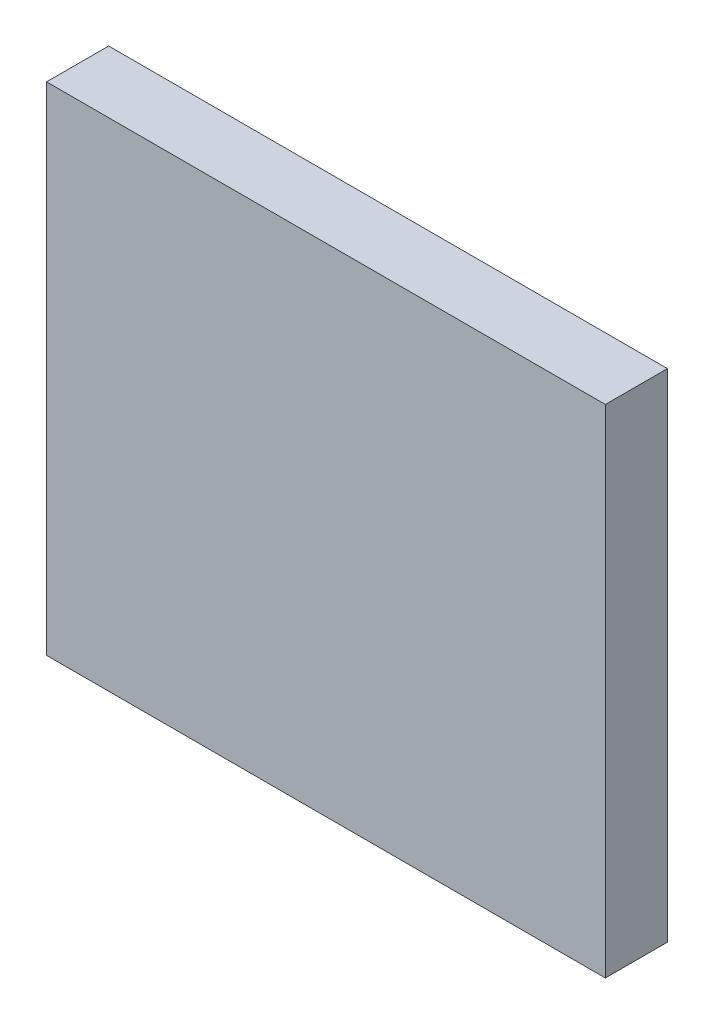
ISO-10303-21;
HEADER;
FILE_DESCRIPTION(('STEP AP214'),'2;1');
FILE_NAME('part.step','',(''),(''),'','','');
FILE_SCHEMA(('AUTOMOTIVE_DESIGN { 1 0 10303 214 1 1 1 1 }'));
ENDSEC;
DATA;
#1=APPLICATION_CONTEXT('core data for automotive mechanical design processes');
#2=APPLICATION_PROTOCOL_DEFINITION('international standard','automotive_design',2000,#1);
#3=PRODUCT_CONTEXT('',#1,'mechanical');
#4=PRODUCT('Part','Part','',(#3));
#5=PRODUCT_RELATED_PRODUCT_CATEGORY('part','',(#4));
#6=PRODUCT_DEFINITION_FORMATION('','',#4);
#7=PRODUCT_DEFINITION_CONTEXT('part definition',#1,'design');
#8=PRODUCT_DEFINITION('design','',#6,#7);
#9=PRODUCT_DEFINITION_SHAPE('','',#8);
#10=(LENGTH_UNIT() NAMED_UNIT(*) SI_UNIT(.MILLI.,.METRE.));
#11=(NAMED_UNIT(*) PLANE_ANGLE_UNIT() SI_UNIT($,.RADIAN.));
#12=(NAMED_UNIT(*) SI_UNIT($,.STERADIAN.) SOLID_ANGLE_UNIT());
#13=UNCERTAINTY_MEASURE_WITH_UNIT(LENGTH_MEASURE(1.E-05),#10,'distance_accuracy_value','');
#14=(GEOMETRIC_REPRESENTATION_CONTEXT(3) GLOBAL_UNCERTAINTY_ASSIGNED_CONTEXT((#13)) GLOBAL_UNIT_ASSIGNED_CONTEXT((#10,
#11,#12)) REPRESENTATION_CONTEXT('',''));
#15=CARTESIAN_POINT('',(0.,0.,0.));
#16=DIRECTION('',(0.,0.,1.));
#17=DIRECTION('',(1.,0.,0.));
#18=AXIS2_PLACEMENT_3D('',#15,#16,#17);
#19=CARTESIAN_POINT('',(0.,0.,10.));
#20=DIRECTION('',(1.,0.,0.));
#21=DIRECTION('',(0.,0.,-1.));
#22=AXIS2_PLACEMENT_3D('',#19,#20,#21);
#23=PLANE('',#22);
#24=DIRECTION('',(0.,-1.,0.));
#25=VECTOR('',#24,1.);
#26=CARTESIAN_POINT('',(0.,0.,0.));
#27=LINE('',#26,#25);
#28=CARTESIAN_POINT('',(0.,80.,0.));
#29=VERTEX_POINT('',#28);
#30=CARTESIAN_POINT('',(0.,0.,0.));
#31=VERTEX_POINT('',#30);
#32=EDGE_CURVE('E95',#29,#31,#27,.T.);
#33=ORIENTED_EDGE('',*,*,#32,.T.);
#34=DIRECTION('',(0.,0.,-1.));
#35=VECTOR('',#34,1.);
#36=CARTESIAN_POINT('',(0.,0.,10.));
#37=LINE('',#36,#35);
#38=CARTESIAN_POINT('',(0.,0.,10.));
#39=VERTEX_POINT('',#38);
#40=EDGE_CURVE('E11',#39,#31,#37,.T.);
#41=ORIENTED_EDGE('',*,*,#40,.F.);
#42=DIRECTION('',(0.,-1.,0.));
#43=VECTOR('',#42,1.);
#44=CARTESIAN_POINT('',(0.,0.,10.));
#45=LINE('',#44,#43);
#46=CARTESIAN_POINT('',(0.,80.,10.));
#47=VERTEX_POINT('',#46);
#48=EDGE_CURVE('E83',#47,#39,#45,.T.);
#49=ORIENTED_EDGE('',*,*,#48,.F.);
#50=DIRECTION('',(0.,0.,-1.));
#51=VECTOR('',#50,1.);
#52=CARTESIAN_POINT('',(0.,80.,10.));
#53=LINE('',#52,#51);
#54=EDGE_CURVE('E91',#47,#29,#53,.T.);
#55=ORIENTED_EDGE('',*,*,#54,.T.);
#56=EDGE_LOOP('',(#33,#41,#49,#55));
#57=FACE_BOUND('',#56,.T.);
#58=ADVANCED_FACE('F32',(#57),#23,.F.);
#59=CARTESIAN_POINT('',(0.,0.,10.));
#60=DIRECTION('',(0.,1.,0.));
#61=DIRECTION('',(0.,0.,1.));
#62=AXIS2_PLACEMENT_3D('',#59,#60,#61);
#63=PLANE('',#62);
#64=DIRECTION('',(1.,0.,0.));
#65=VECTOR('',#64,1.);
#66=CARTESIAN_POINT('',(0.,0.,0.));
#67=LINE('',#66,#65);
#68=CARTESIAN_POINT('',(90.,0.,0.));
#69=VERTEX_POINT('',#68);
#70=EDGE_CURVE('E87',#31,#69,#67,.T.);
#71=ORIENTED_EDGE('',*,*,#70,.T.);
#72=DIRECTION('',(0.,0.,-1.));
#73=VECTOR('',#72,1.);
#74=CARTESIAN_POINT('',(90.,0.,10.));
#75=LINE('',#74,#73);
#76=CARTESIAN_POINT('',(90.,0.,10.));
#77=VERTEX_POINT('',#76);
#78=EDGE_CURVE('E40',#77,#69,#75,.T.);
#79=ORIENTED_EDGE('',*,*,#78,.F.);
#80=DIRECTION('',(1.,0.,0.));
#81=VECTOR('',#80,1.);
#82=CARTESIAN_POINT('',(0.,0.,10.));
#83=LINE('',#82,#81);
#84=EDGE_CURVE('E78',#39,#77,#83,.T.);
#85=ORIENTED_EDGE('',*,*,#84,.F.);
#86=ORIENTED_EDGE('',*,*,#40,.T.);
#87=EDGE_LOOP('',(#71,#79,#85,#86));
#88=FACE_BOUND('',#87,.T.);
#89=ADVANCED_FACE('F86',(#88),#63,.F.);
#90=CARTESIAN_POINT('',(90.,0.,10.));
#91=DIRECTION('',(-1.,0.,0.));
#92=DIRECTION('',(0.,0.,1.));
#93=AXIS2_PLACEMENT_3D('',#90,#91,#92);
#94=PLANE('',#93);
#95=DIRECTION('',(0.,1.,0.));
#96=VECTOR('',#95,1.);
#97=CARTESIAN_POINT('',(90.,0.,0.));
#98=LINE('',#97,#96);
#99=CARTESIAN_POINT('',(90.,80.,0.));
#100=VERTEX_POINT('',#99);
#101=EDGE_CURVE('E65',#69,#100,#98,.T.);
#102=ORIENTED_EDGE('',*,*,#101,.T.);
#103=DIRECTION('',(0.,0.,-1.));
#104=VECTOR('',#103,1.);
#105=CARTESIAN_POINT('',(90.,80.,10.));
#106=LINE('',#105,#104);
#107=CARTESIAN_POINT('',(90.,80.,10.));
#108=VERTEX_POINT('',#107);
#109=EDGE_CURVE('E88',#108,#100,#106,.T.);
#110=ORIENTED_EDGE('',*,*,#109,.F.);
#111=DIRECTION('',(0.,1.,0.));
#112=VECTOR('',#111,1.);
#113=CARTESIAN_POINT('',(90.,0.,10.));
#114=LINE('',#113,#112);
#115=EDGE_CURVE('E81',#77,#108,#114,.T.);
#116=ORIENTED_EDGE('',*,*,#115,.F.);
#117=ORIENTED_EDGE('',*,*,#78,.T.);
#118=EDGE_LOOP('',(#102,#110,#116,#117));
#119=FACE_BOUND('',#118,.T.);
#120=ADVANCED_FACE('F89',(#119),#94,.F.);
#121=CARTESIAN_POINT('',(0.,80.,10.));
#122=DIRECTION('',(0.,-1.,0.));
#123=DIRECTION('',(0.,0.,-1.));
#124=AXIS2_PLACEMENT_3D('',#121,#122,#123);
#125=PLANE('',#124);
#126=DIRECTION('',(-1.,0.,0.));
#127=VECTOR('',#126,1.);
#128=CARTESIAN_POINT('',(0.,80.,0.));
#129=LINE('',#128,#127);
#130=EDGE_CURVE('E71',#100,#29,#129,.T.);
#131=ORIENTED_EDGE('',*,*,#130,.T.);
#132=ORIENTED_EDGE('',*,*,#54,.F.);
#133=DIRECTION('',(-1.,0.,0.));
#134=VECTOR('',#133,1.);
#135=CARTESIAN_POINT('',(0.,80.,10.));
#136=LINE('',#135,#134);
#137=EDGE_CURVE('E48',#108,#47,#136,.T.);
#138=ORIENTED_EDGE('',*,*,#137,.F.);
#139=ORIENTED_EDGE('',*,*,#109,.T.);
#140=EDGE_LOOP('',(#131,#132,#138,#139));
#141=FACE_BOUND('',#140,.T.);
#142=ADVANCED_FACE('F102',(#141),#125,.F.);
#143=CARTESIAN_POINT('',(0.,0.,10.));
#144=DIRECTION('',(0.,0.,-1.));
#145=DIRECTION('',(-1.,0.,0.));
#146=AXIS2_PLACEMENT_3D('',#143,#144,#145);
#147=PLANE('',#146);
#148=ORIENTED_EDGE('',*,*,#48,.T.);
#149=ORIENTED_EDGE('',*,*,#84,.T.);
#150=ORIENTED_EDGE('',*,*,#115,.T.);
#151=ORIENTED_EDGE('',*,*,#137,.T.);
#152=EDGE_LOOP('',(#148,#149,#150,#151));
#153=FACE_BOUND('',#152,.T.);
#154=ADVANCED_FACE('F79',(#153),#147,.F.);
#155=CARTESIAN_POINT('',(0.,0.,0.));
#156=DIRECTION('',(0.,0.,-1.));
#157=DIRECTION('',(-1.,0.,0.));
#158=AXIS2_PLACEMENT_3D('',#155,#156,#157);
#159=PLANE('',#158);
#160=ORIENTED_EDGE('',*,*,#32,.F.);
#161=ORIENTED_EDGE('',*,*,#130,.F.);
#162=ORIENTED_EDGE('',*,*,#101,.F.);
#163=ORIENTED_EDGE('',*,*,#70,.F.);
#164=EDGE_LOOP('',(#160,#161,#162,#163));
#165=FACE_BOUND('',#164,.T.);
#166=ADVANCED_FACE('F105',(#165),#159,.T.);
#167=CLOSED_SHELL('',(#58,#89,#120,#142,#154,#166));
#168=MANIFOLD_SOLID_BREP('B2',#167);
#169=ADVANCED_BREP_SHAPE_REPRESENTATION('',(#18,#168),#14);
#170=SHAPE_DEFINITION_REPRESENTATION(#9,#169);
ENDSEC;
END-ISO-10303-21;
